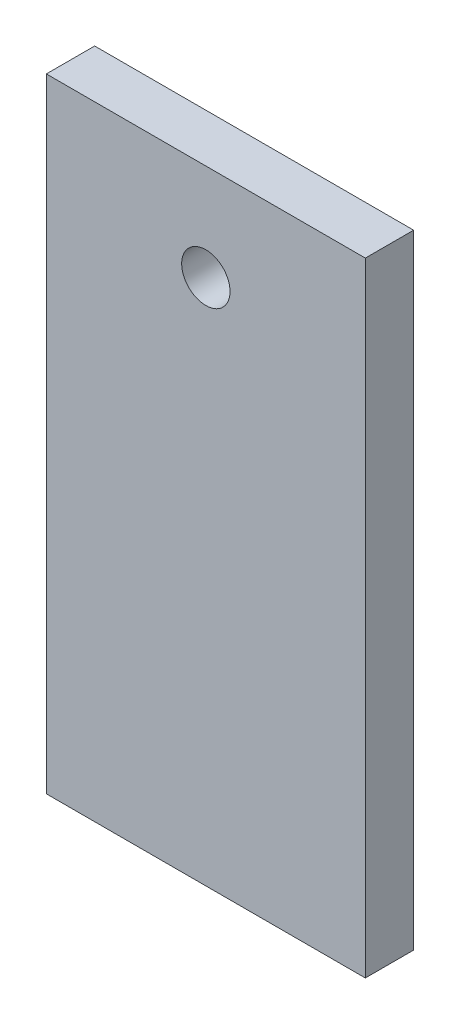
ISO-10303-21;
HEADER;
FILE_DESCRIPTION(('STEP AP214'),'2;1');
FILE_NAME('part.step','',(''),(''),'','','');
FILE_SCHEMA(('AUTOMOTIVE_DESIGN { 1 0 10303 214 1 1 1 1 }'));
ENDSEC;
DATA;
#1=APPLICATION_CONTEXT('core data for automotive mechanical design processes');
#2=APPLICATION_PROTOCOL_DEFINITION('international standard','automotive_design',2000,#1);
#3=PRODUCT_CONTEXT('',#1,'mechanical');
#4=PRODUCT('Part','Part','',(#3));
#5=PRODUCT_RELATED_PRODUCT_CATEGORY('part','',(#4));
#6=PRODUCT_DEFINITION_FORMATION('','',#4);
#7=PRODUCT_DEFINITION_CONTEXT('part definition',#1,'design');
#8=PRODUCT_DEFINITION('design','',#6,#7);
#9=PRODUCT_DEFINITION_SHAPE('','',#8);
#10=(LENGTH_UNIT() NAMED_UNIT(*) SI_UNIT(.MILLI.,.METRE.));
#11=(NAMED_UNIT(*) PLANE_ANGLE_UNIT() SI_UNIT($,.RADIAN.));
#12=(NAMED_UNIT(*) SI_UNIT($,.STERADIAN.) SOLID_ANGLE_UNIT());
#13=UNCERTAINTY_MEASURE_WITH_UNIT(LENGTH_MEASURE(1.E-05),#10,'distance_accuracy_value','');
#14=(GEOMETRIC_REPRESENTATION_CONTEXT(3) GLOBAL_UNCERTAINTY_ASSIGNED_CONTEXT((#13)) GLOBAL_UNIT_ASSIGNED_CONTEXT((#10,
#11,#12)) REPRESENTATION_CONTEXT('',''));
#15=CARTESIAN_POINT('',(0.,0.,0.));
#16=DIRECTION('',(0.,0.,1.));
#17=DIRECTION('',(1.,0.,0.));
#18=AXIS2_PLACEMENT_3D('',#15,#16,#17);
#19=CARTESIAN_POINT('',(0.,0.,10.));
#20=DIRECTION('',(0.,0.,-1.));
#21=DIRECTION('',(-1.,0.,0.));
#22=AXIS2_PLACEMENT_3D('',#19,#20,#21);
#23=PLANE('',#22);
#24=DIRECTION('',(0.,-1.,0.));
#25=VECTOR('',#24,1.);
#26=CARTESIAN_POINT('',(0.,0.,10.));
#27=LINE('',#26,#25);
#28=CARTESIAN_POINT('',(0.,129.,10.));
#29=VERTEX_POINT('',#28);
#30=CARTESIAN_POINT('',(0.,0.,10.));
#31=VERTEX_POINT('',#30);
#32=EDGE_CURVE('E86',#29,#31,#27,.T.);
#33=ORIENTED_EDGE('',*,*,#32,.T.);
#34=DIRECTION('',(1.,0.,0.));
#35=VECTOR('',#34,1.);
#36=CARTESIAN_POINT('',(0.,0.,10.));
#37=LINE('',#36,#35);
#38=CARTESIAN_POINT('',(66.,0.,10.));
#39=VERTEX_POINT('',#38);
#40=EDGE_CURVE('E81',#31,#39,#37,.T.);
#41=ORIENTED_EDGE('',*,*,#40,.T.);
#42=DIRECTION('',(0.,1.,0.));
#43=VECTOR('',#42,1.);
#44=CARTESIAN_POINT('',(66.,0.,10.));
#45=LINE('',#44,#43);
#46=CARTESIAN_POINT('',(66.,129.,10.));
#47=VERTEX_POINT('',#46);
#48=EDGE_CURVE('E84',#39,#47,#45,.T.);
#49=ORIENTED_EDGE('',*,*,#48,.T.);
#50=DIRECTION('',(-1.,0.,0.));
#51=VECTOR('',#50,1.);
#52=CARTESIAN_POINT('',(0.,129.,10.));
#53=LINE('',#52,#51);
#54=EDGE_CURVE('E51',#47,#29,#53,.T.);
#55=ORIENTED_EDGE('',*,*,#54,.T.);
#56=EDGE_LOOP('',(#33,#41,#49,#55));
#57=FACE_BOUND('',#56,.T.);
#58=CARTESIAN_POINT('',(33.,109.,10.));
#59=DIRECTION('',(0.,0.,1.));
#60=DIRECTION('',(1.,0.,0.));
#61=AXIS2_PLACEMENT_3D('',#58,#59,#60);
#62=CIRCLE('',#61,5.);
#63=CARTESIAN_POINT('',(38.,109.,10.));
#64=VERTEX_POINT('',#63);
#65=EDGE_CURVE('E101',#64,#64,#62,.T.);
#66=ORIENTED_EDGE('',*,*,#65,.F.);
#67=EDGE_LOOP('',(#66));
#68=FACE_BOUND('',#67,.T.);
#69=ADVANCED_FACE('F34',(#57,#68),#23,.F.);
#70=CARTESIAN_POINT('',(0.,0.,0.));
#71=DIRECTION('',(0.,0.,-1.));
#72=DIRECTION('',(-1.,0.,0.));
#73=AXIS2_PLACEMENT_3D('',#70,#71,#72);
#74=PLANE('',#73);
#75=DIRECTION('',(0.,-1.,0.));
#76=VECTOR('',#75,1.);
#77=CARTESIAN_POINT('',(0.,0.,0.));
#78=LINE('',#77,#76);
#79=CARTESIAN_POINT('',(0.,129.,0.));
#80=VERTEX_POINT('',#79);
#81=CARTESIAN_POINT('',(0.,0.,0.));
#82=VERTEX_POINT('',#81);
#83=EDGE_CURVE('E98',#80,#82,#78,.T.);
#84=ORIENTED_EDGE('',*,*,#83,.F.);
#85=DIRECTION('',(-1.,0.,0.));
#86=VECTOR('',#85,1.);
#87=CARTESIAN_POINT('',(0.,129.,0.));
#88=LINE('',#87,#86);
#89=CARTESIAN_POINT('',(66.,129.,0.));
#90=VERTEX_POINT('',#89);
#91=EDGE_CURVE('E74',#90,#80,#88,.T.);
#92=ORIENTED_EDGE('',*,*,#91,.F.);
#93=DIRECTION('',(0.,1.,0.));
#94=VECTOR('',#93,1.);
#95=CARTESIAN_POINT('',(66.,0.,0.));
#96=LINE('',#95,#94);
#97=CARTESIAN_POINT('',(66.,0.,0.));
#98=VERTEX_POINT('',#97);
#99=EDGE_CURVE('E68',#98,#90,#96,.T.);
#100=ORIENTED_EDGE('',*,*,#99,.F.);
#101=DIRECTION('',(1.,0.,0.));
#102=VECTOR('',#101,1.);
#103=CARTESIAN_POINT('',(0.,0.,0.));
#104=LINE('',#103,#102);
#105=EDGE_CURVE('E90',#82,#98,#104,.T.);
#106=ORIENTED_EDGE('',*,*,#105,.F.);
#107=EDGE_LOOP('',(#84,#92,#100,#106));
#108=FACE_BOUND('',#107,.T.);
#109=CARTESIAN_POINT('',(33.,109.,0.));
#110=DIRECTION('',(0.,0.,1.));
#111=DIRECTION('',(1.,0.,0.));
#112=AXIS2_PLACEMENT_3D('',#109,#110,#111);
#113=CIRCLE('',#112,5.);
#114=CARTESIAN_POINT('',(38.,109.,0.));
#115=VERTEX_POINT('',#114);
#116=EDGE_CURVE('E113',#115,#115,#113,.T.);
#117=ORIENTED_EDGE('',*,*,#116,.T.);
#118=EDGE_LOOP('',(#117));
#119=FACE_BOUND('',#118,.T.);
#120=ADVANCED_FACE('F109',(#108,#119),#74,.T.);
#121=CARTESIAN_POINT('',(0.,0.,10.));
#122=DIRECTION('',(1.,0.,0.));
#123=DIRECTION('',(0.,0.,-1.));
#124=AXIS2_PLACEMENT_3D('',#121,#122,#123);
#125=PLANE('',#124);
#126=ORIENTED_EDGE('',*,*,#83,.T.);
#127=DIRECTION('',(0.,0.,-1.));
#128=VECTOR('',#127,1.);
#129=CARTESIAN_POINT('',(0.,0.,10.));
#130=LINE('',#129,#128);
#131=EDGE_CURVE('E11',#31,#82,#130,.T.);
#132=ORIENTED_EDGE('',*,*,#131,.F.);
#133=ORIENTED_EDGE('',*,*,#32,.F.);
#134=DIRECTION('',(0.,0.,-1.));
#135=VECTOR('',#134,1.);
#136=CARTESIAN_POINT('',(0.,129.,10.));
#137=LINE('',#136,#135);
#138=EDGE_CURVE('E94',#29,#80,#137,.T.);
#139=ORIENTED_EDGE('',*,*,#138,.T.);
#140=EDGE_LOOP('',(#126,#132,#133,#139));
#141=FACE_BOUND('',#140,.T.);
#142=ADVANCED_FACE('F36',(#141),#125,.F.);
#143=CARTESIAN_POINT('',(0.,0.,10.));
#144=DIRECTION('',(0.,1.,0.));
#145=DIRECTION('',(0.,0.,1.));
#146=AXIS2_PLACEMENT_3D('',#143,#144,#145);
#147=PLANE('',#146);
#148=ORIENTED_EDGE('',*,*,#105,.T.);
#149=DIRECTION('',(0.,0.,-1.));
#150=VECTOR('',#149,1.);
#151=CARTESIAN_POINT('',(66.,0.,10.));
#152=LINE('',#151,#150);
#153=EDGE_CURVE('E43',#39,#98,#152,.T.);
#154=ORIENTED_EDGE('',*,*,#153,.F.);
#155=ORIENTED_EDGE('',*,*,#40,.F.);
#156=ORIENTED_EDGE('',*,*,#131,.T.);
#157=EDGE_LOOP('',(#148,#154,#155,#156));
#158=FACE_BOUND('',#157,.T.);
#159=ADVANCED_FACE('F89',(#158),#147,.F.);
#160=CARTESIAN_POINT('',(66.,0.,10.));
#161=DIRECTION('',(-1.,0.,0.));
#162=DIRECTION('',(0.,0.,1.));
#163=AXIS2_PLACEMENT_3D('',#160,#161,#162);
#164=PLANE('',#163);
#165=ORIENTED_EDGE('',*,*,#99,.T.);
#166=DIRECTION('',(0.,0.,-1.));
#167=VECTOR('',#166,1.);
#168=CARTESIAN_POINT('',(66.,129.,10.));
#169=LINE('',#168,#167);
#170=EDGE_CURVE('E91',#47,#90,#169,.T.);
#171=ORIENTED_EDGE('',*,*,#170,.F.);
#172=ORIENTED_EDGE('',*,*,#48,.F.);
#173=ORIENTED_EDGE('',*,*,#153,.T.);
#174=EDGE_LOOP('',(#165,#171,#172,#173));
#175=FACE_BOUND('',#174,.T.);
#176=ADVANCED_FACE('F92',(#175),#164,.F.);
#177=CARTESIAN_POINT('',(0.,129.,10.));
#178=DIRECTION('',(0.,-1.,0.));
#179=DIRECTION('',(0.,0.,-1.));
#180=AXIS2_PLACEMENT_3D('',#177,#178,#179);
#181=PLANE('',#180);
#182=ORIENTED_EDGE('',*,*,#91,.T.);
#183=ORIENTED_EDGE('',*,*,#138,.F.);
#184=ORIENTED_EDGE('',*,*,#54,.F.);
#185=ORIENTED_EDGE('',*,*,#170,.T.);
#186=EDGE_LOOP('',(#182,#183,#184,#185));
#187=FACE_BOUND('',#186,.T.);
#188=ADVANCED_FACE('F106',(#187),#181,.F.);
#189=CARTESIAN_POINT('',(33.,109.,10.));
#190=DIRECTION('',(0.,0.,-1.));
#191=DIRECTION('',(-1.,0.,0.));
#192=AXIS2_PLACEMENT_3D('',#189,#190,#191);
#193=CYLINDRICAL_SURFACE('',#192,5.);
#194=ORIENTED_EDGE('',*,*,#65,.T.);
#195=EDGE_LOOP('',(#194));
#196=FACE_BOUND('',#195,.T.);
#197=ORIENTED_EDGE('',*,*,#116,.F.);
#198=EDGE_LOOP('',(#197));
#199=FACE_BOUND('',#198,.T.);
#200=ADVANCED_FACE('F119',(#196,#199),#193,.F.);
#201=CLOSED_SHELL('',(#69,#120,#142,#159,#176,#188,#200));
#202=MANIFOLD_SOLID_BREP('B2',#201);
#203=ADVANCED_BREP_SHAPE_REPRESENTATION('',(#18,#202),#14);
#204=SHAPE_DEFINITION_REPRESENTATION(#9,#203);
ENDSEC;
END-ISO-10303-21;
